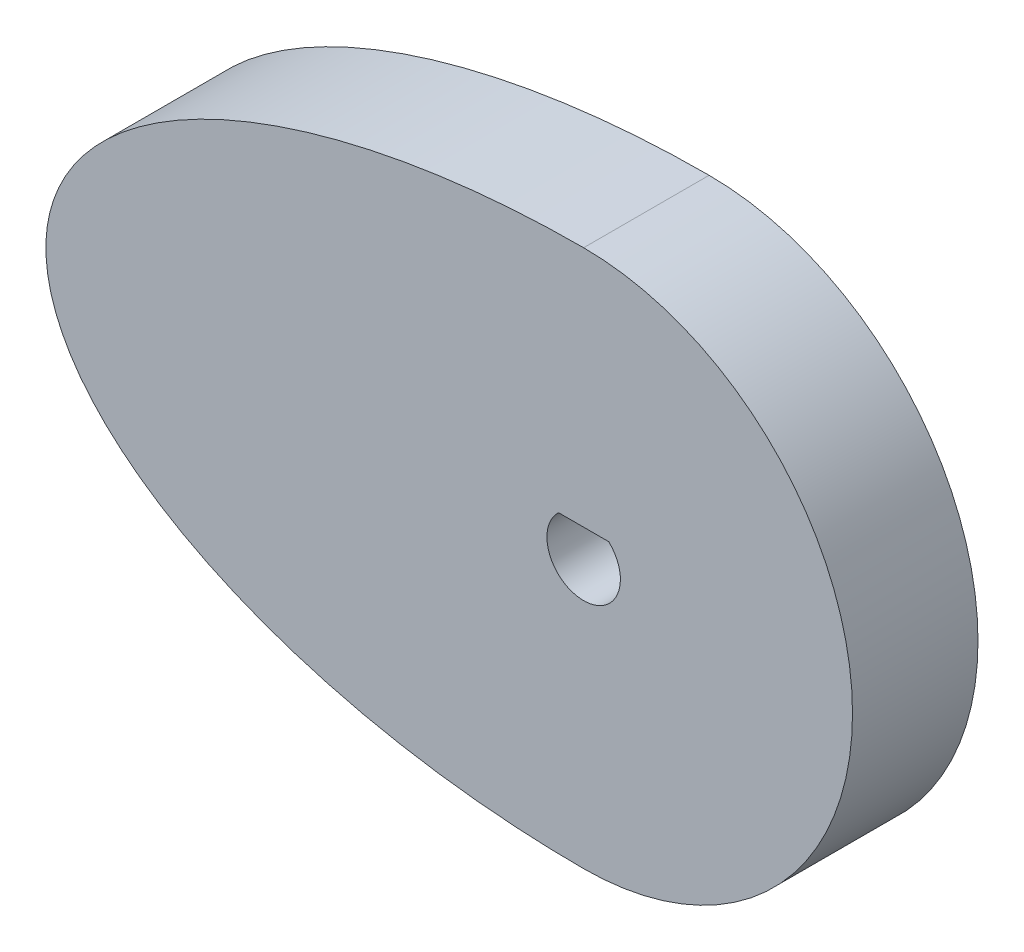
ISO-10303-21;
HEADER;
FILE_DESCRIPTION(('STEP AP214'),'2;1');
FILE_NAME('part.step','',(''),(''),'','','');
FILE_SCHEMA(('AUTOMOTIVE_DESIGN { 1 0 10303 214 1 1 1 1 }'));
ENDSEC;
DATA;
#1=APPLICATION_CONTEXT('core data for automotive mechanical design processes');
#2=APPLICATION_PROTOCOL_DEFINITION('international standard','automotive_design',2000,#1);
#3=PRODUCT_CONTEXT('',#1,'mechanical');
#4=PRODUCT('Part','Part','',(#3));
#5=PRODUCT_RELATED_PRODUCT_CATEGORY('part','',(#4));
#6=PRODUCT_DEFINITION_FORMATION('','',#4);
#7=PRODUCT_DEFINITION_CONTEXT('part definition',#1,'design');
#8=PRODUCT_DEFINITION('design','',#6,#7);
#9=PRODUCT_DEFINITION_SHAPE('','',#8);
#10=(LENGTH_UNIT() NAMED_UNIT(*) SI_UNIT(.MILLI.,.METRE.));
#11=(NAMED_UNIT(*) PLANE_ANGLE_UNIT() SI_UNIT($,.RADIAN.));
#12=(NAMED_UNIT(*) SI_UNIT($,.STERADIAN.) SOLID_ANGLE_UNIT());
#13=UNCERTAINTY_MEASURE_WITH_UNIT(LENGTH_MEASURE(1.E-05),#10,'distance_accuracy_value','');
#14=(GEOMETRIC_REPRESENTATION_CONTEXT(3) GLOBAL_UNCERTAINTY_ASSIGNED_CONTEXT((#13)) GLOBAL_UNIT_ASSIGNED_CONTEXT((#10,
#11,#12)) REPRESENTATION_CONTEXT('',''));
#15=CARTESIAN_POINT('',(0.,0.,0.));
#16=DIRECTION('',(0.,0.,1.));
#17=DIRECTION('',(1.,0.,0.));
#18=AXIS2_PLACEMENT_3D('',#15,#16,#17);
#19=CARTESIAN_POINT('',(0.,0.,14.));
#20=DIRECTION('',(0.,0.,1.));
#21=DIRECTION('',(1.,0.,0.));
#22=AXIS2_PLACEMENT_3D('',#19,#20,#21);
#23=ELLIPSE('',#22,60.,30.);
#24=DIRECTION('',(0.,0.,-1.));
#25=VECTOR('',#24,1.);
#26=SURFACE_OF_LINEAR_EXTRUSION('',#23,#25);
#27=CARTESIAN_POINT('',(0.,0.,0.));
#28=DIRECTION('',(0.,0.,1.));
#29=DIRECTION('',(1.,0.,0.));
#30=AXIS2_PLACEMENT_3D('',#27,#28,#29);
#31=ELLIPSE('',#30,60.,30.);
#32=CARTESIAN_POINT('',(0.,30.,0.));
#33=VERTEX_POINT('',#32);
#34=CARTESIAN_POINT('',(0.,-30.,0.));
#35=VERTEX_POINT('',#34);
#36=EDGE_CURVE('E90',#33,#35,#31,.T.);
#37=ORIENTED_EDGE('',*,*,#36,.T.);
#38=DIRECTION('',(0.,0.,-1.));
#39=VECTOR('',#38,1.);
#40=CARTESIAN_POINT('',(0.,-30.,14.));
#41=LINE('',#40,#39);
#42=CARTESIAN_POINT('',(0.,-30.,14.));
#43=VERTEX_POINT('',#42);
#44=EDGE_CURVE('E11',#43,#35,#41,.T.);
#45=ORIENTED_EDGE('',*,*,#44,.F.);
#46=CARTESIAN_POINT('',(0.,30.,14.));
#47=VERTEX_POINT('',#46);
#48=EDGE_CURVE('E91',#47,#43,#23,.T.);
#49=ORIENTED_EDGE('',*,*,#48,.F.);
#50=DIRECTION('',(0.,0.,-1.));
#51=VECTOR('',#50,1.);
#52=CARTESIAN_POINT('',(0.,30.,14.));
#53=LINE('',#52,#51);
#54=EDGE_CURVE('E41',#47,#33,#53,.T.);
#55=ORIENTED_EDGE('',*,*,#54,.T.);
#56=EDGE_LOOP('',(#37,#45,#49,#55));
#57=FACE_BOUND('',#56,.T.);
#58=ADVANCED_FACE('F33',(#57),#26,.F.);
#59=CARTESIAN_POINT('',(0.,0.,14.));
#60=DIRECTION('',(0.,0.,-1.));
#61=DIRECTION('',(-1.,0.,0.));
#62=AXIS2_PLACEMENT_3D('',#59,#60,#61);
#63=CYLINDRICAL_SURFACE('',#62,30.);
#64=CARTESIAN_POINT('',(0.,0.,0.));
#65=DIRECTION('',(0.,0.,1.));
#66=DIRECTION('',(1.,0.,0.));
#67=AXIS2_PLACEMENT_3D('',#64,#65,#66);
#68=CIRCLE('',#67,30.);
#69=EDGE_CURVE('E96',#35,#33,#68,.T.);
#70=ORIENTED_EDGE('',*,*,#69,.T.);
#71=ORIENTED_EDGE('',*,*,#54,.F.);
#72=CARTESIAN_POINT('',(0.,0.,14.));
#73=DIRECTION('',(0.,0.,1.));
#74=DIRECTION('',(1.,0.,0.));
#75=AXIS2_PLACEMENT_3D('',#72,#73,#74);
#76=CIRCLE('',#75,30.);
#77=EDGE_CURVE('E95',#43,#47,#76,.T.);
#78=ORIENTED_EDGE('',*,*,#77,.F.);
#79=ORIENTED_EDGE('',*,*,#44,.T.);
#80=EDGE_LOOP('',(#70,#71,#78,#79));
#81=FACE_BOUND('',#80,.T.);
#82=ADVANCED_FACE('F109',(#81),#63,.T.);
#83=CARTESIAN_POINT('',(0.,0.,14.));
#84=DIRECTION('',(0.,0.,1.));
#85=DIRECTION('',(1.,0.,0.));
#86=AXIS2_PLACEMENT_3D('',#83,#84,#85);
#87=PLANE('',#86);
#88=DIRECTION('',(1.,0.,0.));
#89=VECTOR('',#88,1.);
#90=CARTESIAN_POINT('',(2.79463772249642,3.,14.));
#91=LINE('',#90,#89);
#92=CARTESIAN_POINT('',(-2.79463772249642,3.,14.));
#93=VERTEX_POINT('',#92);
#94=CARTESIAN_POINT('',(2.79463772249642,3.,14.));
#95=VERTEX_POINT('',#94);
#96=EDGE_CURVE('E81',#93,#95,#91,.T.);
#97=ORIENTED_EDGE('',*,*,#96,.T.);
#98=CARTESIAN_POINT('',(0.,0.,14.));
#99=DIRECTION('',(0.,0.,1.));
#100=DIRECTION('',(1.,0.,0.));
#101=AXIS2_PLACEMENT_3D('',#98,#99,#100);
#102=CIRCLE('',#101,4.1);
#103=EDGE_CURVE('E73',#95,#93,#102,.F.);
#104=ORIENTED_EDGE('',*,*,#103,.T.);
#105=EDGE_LOOP('',(#97,#104));
#106=FACE_BOUND('',#105,.T.);
#107=ORIENTED_EDGE('',*,*,#48,.T.);
#108=ORIENTED_EDGE('',*,*,#77,.T.);
#109=EDGE_LOOP('',(#107,#108));
#110=FACE_BOUND('',#109,.T.);
#111=ADVANCED_FACE('F83',(#106,#110),#87,.T.);
#112=CARTESIAN_POINT('',(0.,0.,0.));
#113=DIRECTION('',(0.,0.,1.));
#114=DIRECTION('',(1.,0.,0.));
#115=AXIS2_PLACEMENT_3D('',#112,#113,#114);
#116=PLANE('',#115);
#117=CARTESIAN_POINT('',(0.,0.,0.));
#118=DIRECTION('',(0.,0.,-1.));
#119=DIRECTION('',(-1.,0.,0.));
#120=AXIS2_PLACEMENT_3D('',#117,#118,#119);
#121=CIRCLE('',#120,4.1);
#122=CARTESIAN_POINT('',(2.79463772249642,3.,0.));
#123=VERTEX_POINT('',#122);
#124=CARTESIAN_POINT('',(-2.79463772249642,3.,0.));
#125=VERTEX_POINT('',#124);
#126=EDGE_CURVE('E86',#123,#125,#121,.T.);
#127=ORIENTED_EDGE('',*,*,#126,.F.);
#128=DIRECTION('',(1.,0.,0.));
#129=VECTOR('',#128,1.);
#130=CARTESIAN_POINT('',(2.79463772249642,3.,0.));
#131=LINE('',#130,#129);
#132=EDGE_CURVE('E55',#125,#123,#131,.T.);
#133=ORIENTED_EDGE('',*,*,#132,.F.);
#134=EDGE_LOOP('',(#127,#133));
#135=FACE_BOUND('',#134,.T.);
#136=ORIENTED_EDGE('',*,*,#36,.F.);
#137=ORIENTED_EDGE('',*,*,#69,.F.);
#138=EDGE_LOOP('',(#136,#137));
#139=FACE_BOUND('',#138,.T.);
#140=ADVANCED_FACE('F108',(#135,#139),#116,.F.);
#141=CARTESIAN_POINT('',(2.79463772249642,3.,24.8466584716216));
#142=DIRECTION('',(0.,1.,0.));
#143=DIRECTION('',(-1.,0.,0.));
#144=AXIS2_PLACEMENT_3D('',#141,#142,#143);
#145=PLANE('',#144);
#146=DIRECTION('',(0.,0.,-1.));
#147=VECTOR('',#146,1.);
#148=CARTESIAN_POINT('',(-2.79463772249642,3.,24.8466584716216));
#149=LINE('',#148,#147);
#150=EDGE_CURVE('E48',#93,#125,#149,.T.);
#151=ORIENTED_EDGE('',*,*,#150,.T.);
#152=ORIENTED_EDGE('',*,*,#132,.T.);
#153=DIRECTION('',(0.,0.,-1.));
#154=VECTOR('',#153,1.);
#155=CARTESIAN_POINT('',(2.79463772249642,3.,24.8466584716216));
#156=LINE('',#155,#154);
#157=EDGE_CURVE('E75',#95,#123,#156,.T.);
#158=ORIENTED_EDGE('',*,*,#157,.F.);
#159=ORIENTED_EDGE('',*,*,#96,.F.);
#160=EDGE_LOOP('',(#151,#152,#158,#159));
#161=FACE_BOUND('',#160,.T.);
#162=ADVANCED_FACE('F80',(#161),#145,.F.);
#163=CARTESIAN_POINT('',(0.,0.,24.8466584716216));
#164=DIRECTION('',(0.,0.,-1.));
#165=DIRECTION('',(-1.,0.,0.));
#166=AXIS2_PLACEMENT_3D('',#163,#164,#165);
#167=CYLINDRICAL_SURFACE('',#166,4.1);
#168=ORIENTED_EDGE('',*,*,#157,.T.);
#169=ORIENTED_EDGE('',*,*,#126,.T.);
#170=ORIENTED_EDGE('',*,*,#150,.F.);
#171=ORIENTED_EDGE('',*,*,#103,.F.);
#172=EDGE_LOOP('',(#168,#169,#170,#171));
#173=FACE_BOUND('',#172,.T.);
#174=ADVANCED_FACE('F74',(#173),#167,.F.);
#175=CLOSED_SHELL('',(#58,#82,#111,#140,#162,#174));
#176=MANIFOLD_SOLID_BREP('B2',#175);
#177=ADVANCED_BREP_SHAPE_REPRESENTATION('',(#18,#176),#14);
#178=SHAPE_DEFINITION_REPRESENTATION(#9,#177);
ENDSEC;
END-ISO-10303-21;
